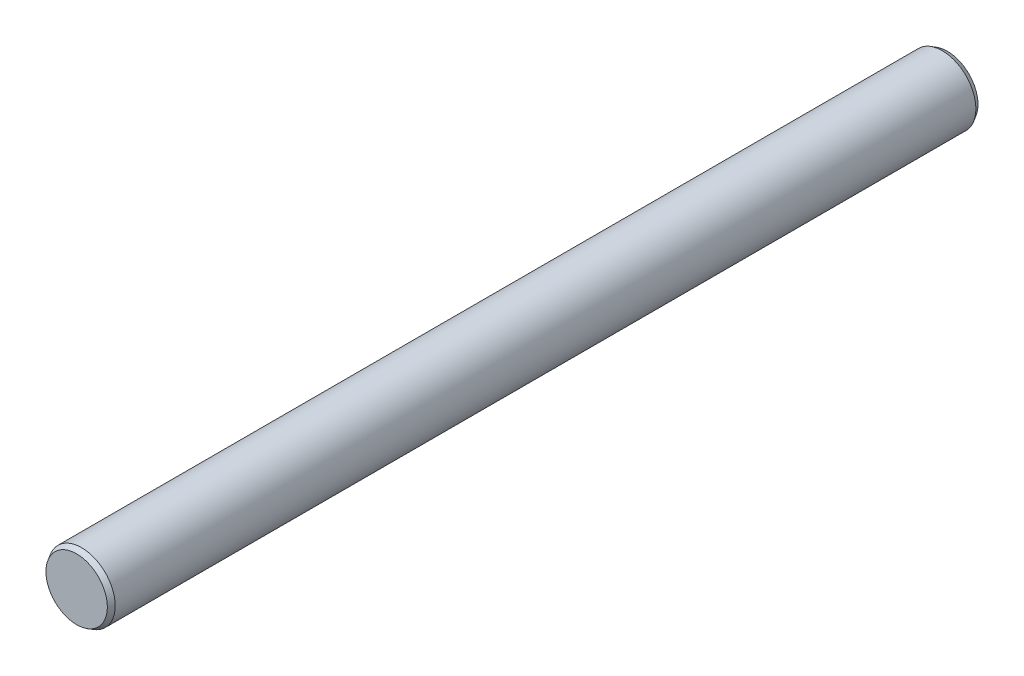
ISO-10303-21;
HEADER;
FILE_DESCRIPTION(('STEP AP214'),'2;1');
FILE_NAME('part.step','',(''),(''),'','','');
FILE_SCHEMA(('AUTOMOTIVE_DESIGN { 1 0 10303 214 1 1 1 1 }'));
ENDSEC;
DATA;
#1=APPLICATION_CONTEXT('core data for automotive mechanical design processes');
#2=APPLICATION_PROTOCOL_DEFINITION('international standard','automotive_design',2000,#1);
#3=PRODUCT_CONTEXT('',#1,'mechanical');
#4=PRODUCT('Part','Part','',(#3));
#5=PRODUCT_RELATED_PRODUCT_CATEGORY('part','',(#4));
#6=PRODUCT_DEFINITION_FORMATION('','',#4);
#7=PRODUCT_DEFINITION_CONTEXT('part definition',#1,'design');
#8=PRODUCT_DEFINITION('design','',#6,#7);
#9=PRODUCT_DEFINITION_SHAPE('','',#8);
#10=(LENGTH_UNIT() NAMED_UNIT(*) SI_UNIT(.MILLI.,.METRE.));
#11=(NAMED_UNIT(*) PLANE_ANGLE_UNIT() SI_UNIT($,.RADIAN.));
#12=(NAMED_UNIT(*) SI_UNIT($,.STERADIAN.) SOLID_ANGLE_UNIT());
#13=UNCERTAINTY_MEASURE_WITH_UNIT(LENGTH_MEASURE(1.E-05),#10,'distance_accuracy_value','');
#14=(GEOMETRIC_REPRESENTATION_CONTEXT(3) GLOBAL_UNCERTAINTY_ASSIGNED_CONTEXT((#13)) GLOBAL_UNIT_ASSIGNED_CONTEXT((#10,
#11,#12)) REPRESENTATION_CONTEXT('',''));
#15=CARTESIAN_POINT('',(0.,0.,0.));
#16=DIRECTION('',(0.,0.,1.));
#17=DIRECTION('',(1.,0.,0.));
#18=AXIS2_PLACEMENT_3D('',#15,#16,#17);
#19=CARTESIAN_POINT('',(0.,0.,22.225));
#20=DIRECTION('',(0.,0.,-1.));
#21=DIRECTION('',(-1.,0.,0.));
#22=AXIS2_PLACEMENT_3D('',#19,#20,#21);
#23=CYLINDRICAL_SURFACE('',#22,1.7145);
#24=CARTESIAN_POINT('',(0.,0.,-21.971));
#25=DIRECTION('',(0.,0.,1.));
#26=DIRECTION('',(1.,0.,0.));
#27=AXIS2_PLACEMENT_3D('',#24,#25,#26);
#28=CIRCLE('',#27,1.7145);
#29=CARTESIAN_POINT('',(1.7145,0.,-21.971));
#30=VERTEX_POINT('',#29);
#31=EDGE_CURVE('E40',#30,#30,#28,.T.);
#32=ORIENTED_EDGE('',*,*,#31,.T.);
#33=EDGE_LOOP('',(#32));
#34=FACE_BOUND('',#33,.T.);
#35=CARTESIAN_POINT('',(0.,0.,21.971));
#36=DIRECTION('',(0.,0.,1.));
#37=DIRECTION('',(1.,0.,0.));
#38=AXIS2_PLACEMENT_3D('',#35,#36,#37);
#39=CIRCLE('',#38,1.7145);
#40=CARTESIAN_POINT('',(1.7145,0.,21.971));
#41=VERTEX_POINT('',#40);
#42=EDGE_CURVE('E44',#41,#41,#39,.F.);
#43=ORIENTED_EDGE('',*,*,#42,.T.);
#44=EDGE_LOOP('',(#43));
#45=FACE_BOUND('',#44,.T.);
#46=ADVANCED_FACE('F30',(#34,#45),#23,.T.);
#47=CARTESIAN_POINT('',(0.,0.,22.225));
#48=DIRECTION('',(0.,0.,1.));
#49=DIRECTION('',(1.,0.,0.));
#50=AXIS2_PLACEMENT_3D('',#47,#48,#49);
#51=PLANE('',#50);
#52=CARTESIAN_POINT('',(0.,0.,22.225));
#53=DIRECTION('',(0.,0.,1.));
#54=DIRECTION('',(1.,0.,0.));
#55=AXIS2_PLACEMENT_3D('',#52,#53,#54);
#56=CIRCLE('',#55,1.56785303162584);
#57=CARTESIAN_POINT('',(1.56785303162584,0.,22.225));
#58=VERTEX_POINT('',#57);
#59=EDGE_CURVE('E10',#58,#58,#56,.T.);
#60=ORIENTED_EDGE('',*,*,#59,.T.);
#61=EDGE_LOOP('',(#60));
#62=FACE_BOUND('',#61,.T.);
#63=ADVANCED_FACE('F63',(#62),#51,.T.);
#64=CARTESIAN_POINT('',(0.,0.,-22.225));
#65=DIRECTION('',(0.,0.,1.));
#66=DIRECTION('',(1.,0.,0.));
#67=AXIS2_PLACEMENT_3D('',#64,#65,#66);
#68=PLANE('',#67);
#69=CARTESIAN_POINT('',(0.,0.,-22.225));
#70=DIRECTION('',(0.,0.,1.));
#71=DIRECTION('',(1.,0.,0.));
#72=AXIS2_PLACEMENT_3D('',#69,#70,#71);
#73=CIRCLE('',#72,1.56785303162583);
#74=CARTESIAN_POINT('',(1.56785303162583,0.,-22.225));
#75=VERTEX_POINT('',#74);
#76=EDGE_CURVE('E36',#75,#75,#73,.F.);
#77=ORIENTED_EDGE('',*,*,#76,.T.);
#78=EDGE_LOOP('',(#77));
#79=FACE_BOUND('',#78,.T.);
#80=ADVANCED_FACE('F59',(#79),#68,.F.);
#81=CARTESIAN_POINT('',(0.,0.,-21.971));
#82=DIRECTION('',(0.,0.,1.));
#83=DIRECTION('',(1.,0.,0.));
#84=AXIS2_PLACEMENT_3D('',#81,#82,#83);
#85=CONICAL_SURFACE('',#84,1.7145,0.523598775598304);
#86=ORIENTED_EDGE('',*,*,#76,.F.);
#87=EDGE_LOOP('',(#86));
#88=FACE_BOUND('',#87,.T.);
#89=ORIENTED_EDGE('',*,*,#31,.F.);
#90=EDGE_LOOP('',(#89));
#91=FACE_BOUND('',#90,.T.);
#92=ADVANCED_FACE('F54',(#88,#91),#85,.T.);
#93=CARTESIAN_POINT('',(0.,0.,22.225));
#94=DIRECTION('',(0.,0.,-1.));
#95=DIRECTION('',(-1.,0.,0.));
#96=AXIS2_PLACEMENT_3D('',#93,#94,#95);
#97=CONICAL_SURFACE('',#96,1.56785303162584,0.523598775598305);
#98=ORIENTED_EDGE('',*,*,#42,.F.);
#99=EDGE_LOOP('',(#98));
#100=FACE_BOUND('',#99,.T.);
#101=ORIENTED_EDGE('',*,*,#59,.F.);
#102=EDGE_LOOP('',(#101));
#103=FACE_BOUND('',#102,.T.);
#104=ADVANCED_FACE('F51',(#100,#103),#97,.T.);
#105=CLOSED_SHELL('',(#46,#63,#80,#92,#104));
#106=MANIFOLD_SOLID_BREP('B2',#105);
#107=ADVANCED_BREP_SHAPE_REPRESENTATION('',(#18,#106),#14);
#108=SHAPE_DEFINITION_REPRESENTATION(#9,#107);
ENDSEC;
END-ISO-10303-21;
